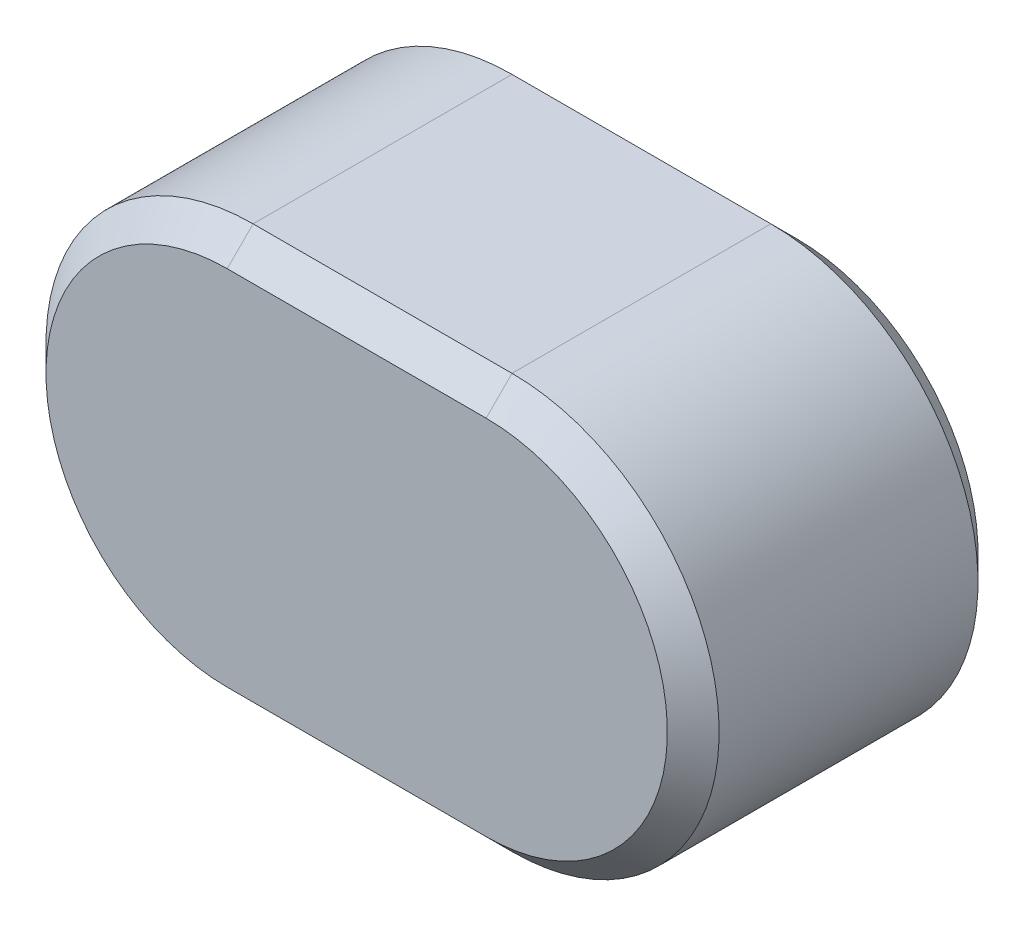
ISO-10303-21;
HEADER;
FILE_DESCRIPTION(('STEP AP214'),'2;1');
FILE_NAME('part.step','',(''),(''),'','','');
FILE_SCHEMA(('AUTOMOTIVE_DESIGN { 1 0 10303 214 1 1 1 1 }'));
ENDSEC;
DATA;
#1=APPLICATION_CONTEXT('core data for automotive mechanical design processes');
#2=APPLICATION_PROTOCOL_DEFINITION('international standard','automotive_design',2000,#1);
#3=PRODUCT_CONTEXT('',#1,'mechanical');
#4=PRODUCT('Part','Part','',(#3));
#5=PRODUCT_RELATED_PRODUCT_CATEGORY('part','',(#4));
#6=PRODUCT_DEFINITION_FORMATION('','',#4);
#7=PRODUCT_DEFINITION_CONTEXT('part definition',#1,'design');
#8=PRODUCT_DEFINITION('design','',#6,#7);
#9=PRODUCT_DEFINITION_SHAPE('','',#8);
#10=(LENGTH_UNIT() NAMED_UNIT(*) SI_UNIT(.MILLI.,.METRE.));
#11=(NAMED_UNIT(*) PLANE_ANGLE_UNIT() SI_UNIT($,.RADIAN.));
#12=(NAMED_UNIT(*) SI_UNIT($,.STERADIAN.) SOLID_ANGLE_UNIT());
#13=UNCERTAINTY_MEASURE_WITH_UNIT(LENGTH_MEASURE(1.E-05),#10,'distance_accuracy_value','');
#14=(GEOMETRIC_REPRESENTATION_CONTEXT(3) GLOBAL_UNCERTAINTY_ASSIGNED_CONTEXT((#13)) GLOBAL_UNIT_ASSIGNED_CONTEXT((#10,
#11,#12)) REPRESENTATION_CONTEXT('',''));
#15=CARTESIAN_POINT('',(0.,0.,0.));
#16=DIRECTION('',(0.,0.,1.));
#17=DIRECTION('',(1.,0.,0.));
#18=AXIS2_PLACEMENT_3D('',#15,#16,#17);
#19=CARTESIAN_POINT('',(-2.5,0.,6.));
#20=DIRECTION('',(0.,0.,-1.));
#21=DIRECTION('',(-1.,0.,0.));
#22=AXIS2_PLACEMENT_3D('',#19,#20,#21);
#23=CYLINDRICAL_SURFACE('',#22,4.);
#24=DIRECTION('',(0.,0.,-1.));
#25=VECTOR('',#24,1.);
#26=CARTESIAN_POINT('',(-2.5,4.,6.));
#27=LINE('',#26,#25);
#28=CARTESIAN_POINT('',(-2.5,4.,5.5));
#29=VERTEX_POINT('',#28);
#30=CARTESIAN_POINT('',(-2.5,4.,0.5));
#31=VERTEX_POINT('',#30);
#32=EDGE_CURVE('E173',#29,#31,#27,.T.);
#33=ORIENTED_EDGE('',*,*,#32,.T.);
#34=CARTESIAN_POINT('',(-2.5,0.,0.5));
#35=DIRECTION('',(0.,0.,1.));
#36=DIRECTION('',(1.,0.,0.));
#37=AXIS2_PLACEMENT_3D('',#34,#35,#36);
#38=CIRCLE('',#37,4.);
#39=CARTESIAN_POINT('',(-2.5,-4.,0.5));
#40=VERTEX_POINT('',#39);
#41=EDGE_CURVE('E154',#31,#40,#38,.T.);
#42=ORIENTED_EDGE('',*,*,#41,.T.);
#43=DIRECTION('',(0.,0.,-1.));
#44=VECTOR('',#43,1.);
#45=CARTESIAN_POINT('',(-2.5,-4.,6.));
#46=LINE('',#45,#44);
#47=CARTESIAN_POINT('',(-2.5,-4.,5.5));
#48=VERTEX_POINT('',#47);
#49=EDGE_CURVE('E129',#48,#40,#46,.T.);
#50=ORIENTED_EDGE('',*,*,#49,.F.);
#51=CARTESIAN_POINT('',(-2.5,0.,5.5));
#52=DIRECTION('',(0.,0.,1.));
#53=DIRECTION('',(1.,0.,0.));
#54=AXIS2_PLACEMENT_3D('',#51,#52,#53);
#55=CIRCLE('',#54,4.);
#56=EDGE_CURVE('E151',#48,#29,#55,.F.);
#57=ORIENTED_EDGE('',*,*,#56,.T.);
#58=EDGE_LOOP('',(#33,#42,#50,#57));
#59=FACE_BOUND('',#58,.T.);
#60=ADVANCED_FACE('F36',(#59),#23,.T.);
#61=CARTESIAN_POINT('',(-2.5,-4.,6.));
#62=DIRECTION('',(0.,1.,0.));
#63=DIRECTION('',(-1.,0.,0.));
#64=AXIS2_PLACEMENT_3D('',#61,#62,#63);
#65=PLANE('',#64);
#66=ORIENTED_EDGE('',*,*,#49,.T.);
#67=DIRECTION('',(1.,0.,0.));
#68=VECTOR('',#67,1.);
#69=CARTESIAN_POINT('',(-2.5,-4.,0.5));
#70=LINE('',#69,#68);
#71=CARTESIAN_POINT('',(2.5,-4.,0.5));
#72=VERTEX_POINT('',#71);
#73=EDGE_CURVE('E128',#40,#72,#70,.T.);
#74=ORIENTED_EDGE('',*,*,#73,.T.);
#75=DIRECTION('',(0.,0.,-1.));
#76=VECTOR('',#75,1.);
#77=CARTESIAN_POINT('',(2.5,-4.,6.));
#78=LINE('',#77,#76);
#79=CARTESIAN_POINT('',(2.5,-4.,5.5));
#80=VERTEX_POINT('',#79);
#81=EDGE_CURVE('E110',#80,#72,#78,.T.);
#82=ORIENTED_EDGE('',*,*,#81,.F.);
#83=DIRECTION('',(-1.,0.,0.));
#84=VECTOR('',#83,1.);
#85=CARTESIAN_POINT('',(-2.5,-4.,5.5));
#86=LINE('',#85,#84);
#87=EDGE_CURVE('E125',#80,#48,#86,.T.);
#88=ORIENTED_EDGE('',*,*,#87,.T.);
#89=EDGE_LOOP('',(#66,#74,#82,#88));
#90=FACE_BOUND('',#89,.T.);
#91=ADVANCED_FACE('F123',(#90),#65,.F.);
#92=CARTESIAN_POINT('',(2.5,0.,6.));
#93=DIRECTION('',(0.,0.,-1.));
#94=DIRECTION('',(-1.,0.,0.));
#95=AXIS2_PLACEMENT_3D('',#92,#93,#94);
#96=CYLINDRICAL_SURFACE('',#95,4.);
#97=ORIENTED_EDGE('',*,*,#81,.T.);
#98=CARTESIAN_POINT('',(2.5,0.,0.5));
#99=DIRECTION('',(0.,0.,1.));
#100=DIRECTION('',(1.,0.,0.));
#101=AXIS2_PLACEMENT_3D('',#98,#99,#100);
#102=CIRCLE('',#101,4.);
#103=CARTESIAN_POINT('',(2.5,4.,0.5));
#104=VERTEX_POINT('',#103);
#105=EDGE_CURVE('E117',#72,#104,#102,.T.);
#106=ORIENTED_EDGE('',*,*,#105,.T.);
#107=DIRECTION('',(0.,0.,-1.));
#108=VECTOR('',#107,1.);
#109=CARTESIAN_POINT('',(2.5,4.,6.));
#110=LINE('',#109,#108);
#111=CARTESIAN_POINT('',(2.5,4.,5.5));
#112=VERTEX_POINT('',#111);
#113=EDGE_CURVE('E112',#112,#104,#110,.T.);
#114=ORIENTED_EDGE('',*,*,#113,.F.);
#115=CARTESIAN_POINT('',(2.5,0.,5.5));
#116=DIRECTION('',(0.,0.,1.));
#117=DIRECTION('',(1.,0.,0.));
#118=AXIS2_PLACEMENT_3D('',#115,#116,#117);
#119=CIRCLE('',#118,4.);
#120=EDGE_CURVE('E107',#112,#80,#119,.F.);
#121=ORIENTED_EDGE('',*,*,#120,.T.);
#122=EDGE_LOOP('',(#97,#106,#114,#121));
#123=FACE_BOUND('',#122,.T.);
#124=ADVANCED_FACE('F109',(#123),#96,.T.);
#125=CARTESIAN_POINT('',(-2.5,4.,6.));
#126=DIRECTION('',(0.,-1.,0.));
#127=DIRECTION('',(1.,0.,0.));
#128=AXIS2_PLACEMENT_3D('',#125,#126,#127);
#129=PLANE('',#128);
#130=ORIENTED_EDGE('',*,*,#113,.T.);
#131=DIRECTION('',(-1.,0.,0.));
#132=VECTOR('',#131,1.);
#133=CARTESIAN_POINT('',(-2.5,4.,0.5));
#134=LINE('',#133,#132);
#135=EDGE_CURVE('E158',#104,#31,#134,.T.);
#136=ORIENTED_EDGE('',*,*,#135,.T.);
#137=ORIENTED_EDGE('',*,*,#32,.F.);
#138=DIRECTION('',(1.,0.,0.));
#139=VECTOR('',#138,1.);
#140=CARTESIAN_POINT('',(2.5,4.,5.5));
#141=LINE('',#140,#139);
#142=EDGE_CURVE('E156',#29,#112,#141,.T.);
#143=ORIENTED_EDGE('',*,*,#142,.T.);
#144=EDGE_LOOP('',(#130,#136,#137,#143));
#145=FACE_BOUND('',#144,.T.);
#146=ADVANCED_FACE('F184',(#145),#129,.F.);
#147=CARTESIAN_POINT('',(-2.5,0.,6.));
#148=DIRECTION('',(0.,0.,1.));
#149=DIRECTION('',(1.,0.,0.));
#150=AXIS2_PLACEMENT_3D('',#147,#148,#149);
#151=PLANE('',#150);
#152=DIRECTION('',(-1.,0.,0.));
#153=VECTOR('',#152,1.);
#154=CARTESIAN_POINT('',(-2.5,3.5,6.));
#155=LINE('',#154,#153);
#156=CARTESIAN_POINT('',(2.5,3.5,6.));
#157=VERTEX_POINT('',#156);
#158=CARTESIAN_POINT('',(-2.5,3.5,6.));
#159=VERTEX_POINT('',#158);
#160=EDGE_CURVE('E61',#157,#159,#155,.T.);
#161=ORIENTED_EDGE('',*,*,#160,.T.);
#162=CARTESIAN_POINT('',(-2.5,0.,6.));
#163=DIRECTION('',(0.,0.,1.));
#164=DIRECTION('',(1.,0.,0.));
#165=AXIS2_PLACEMENT_3D('',#162,#163,#164);
#166=CIRCLE('',#165,3.5);
#167=CARTESIAN_POINT('',(-2.5,-3.5,6.));
#168=VERTEX_POINT('',#167);
#169=EDGE_CURVE('E11',#159,#168,#166,.T.);
#170=ORIENTED_EDGE('',*,*,#169,.T.);
#171=DIRECTION('',(1.,0.,0.));
#172=VECTOR('',#171,1.);
#173=CARTESIAN_POINT('',(2.5,-3.5,6.));
#174=LINE('',#173,#172);
#175=CARTESIAN_POINT('',(2.5,-3.5,6.));
#176=VERTEX_POINT('',#175);
#177=EDGE_CURVE('E46',#168,#176,#174,.T.);
#178=ORIENTED_EDGE('',*,*,#177,.T.);
#179=CARTESIAN_POINT('',(2.5,0.,6.));
#180=DIRECTION('',(0.,0.,1.));
#181=DIRECTION('',(1.,0.,0.));
#182=AXIS2_PLACEMENT_3D('',#179,#180,#181);
#183=CIRCLE('',#182,3.5);
#184=EDGE_CURVE('E134',#176,#157,#183,.T.);
#185=ORIENTED_EDGE('',*,*,#184,.T.);
#186=EDGE_LOOP('',(#161,#170,#178,#185));
#187=FACE_BOUND('',#186,.T.);
#188=ADVANCED_FACE('F282',(#187),#151,.T.);
#189=CARTESIAN_POINT('',(-2.5,0.,0.));
#190=DIRECTION('',(0.,0.,1.));
#191=DIRECTION('',(1.,0.,0.));
#192=AXIS2_PLACEMENT_3D('',#189,#190,#191);
#193=PLANE('',#192);
#194=CARTESIAN_POINT('',(2.5,0.,0.));
#195=DIRECTION('',(0.,0.,1.));
#196=DIRECTION('',(1.,0.,0.));
#197=AXIS2_PLACEMENT_3D('',#194,#195,#196);
#198=CIRCLE('',#197,3.5);
#199=CARTESIAN_POINT('',(2.5,3.5,0.));
#200=VERTEX_POINT('',#199);
#201=CARTESIAN_POINT('',(2.5,-3.5,0.));
#202=VERTEX_POINT('',#201);
#203=EDGE_CURVE('E146',#200,#202,#198,.F.);
#204=ORIENTED_EDGE('',*,*,#203,.T.);
#205=DIRECTION('',(-1.,0.,0.));
#206=VECTOR('',#205,1.);
#207=CARTESIAN_POINT('',(-2.5,-3.5,0.));
#208=LINE('',#207,#206);
#209=CARTESIAN_POINT('',(-2.5,-3.5,0.));
#210=VERTEX_POINT('',#209);
#211=EDGE_CURVE('E118',#202,#210,#208,.T.);
#212=ORIENTED_EDGE('',*,*,#211,.T.);
#213=CARTESIAN_POINT('',(-2.5,0.,0.));
#214=DIRECTION('',(0.,0.,1.));
#215=DIRECTION('',(1.,0.,0.));
#216=AXIS2_PLACEMENT_3D('',#213,#214,#215);
#217=CIRCLE('',#216,3.5);
#218=CARTESIAN_POINT('',(-2.5,3.5,0.));
#219=VERTEX_POINT('',#218);
#220=EDGE_CURVE('E144',#210,#219,#217,.F.);
#221=ORIENTED_EDGE('',*,*,#220,.T.);
#222=DIRECTION('',(1.,0.,0.));
#223=VECTOR('',#222,1.);
#224=CARTESIAN_POINT('',(-2.5,3.5,0.));
#225=LINE('',#224,#223);
#226=EDGE_CURVE('E139',#219,#200,#225,.T.);
#227=ORIENTED_EDGE('',*,*,#226,.T.);
#228=EDGE_LOOP('',(#204,#212,#221,#227));
#229=FACE_BOUND('',#228,.T.);
#230=ADVANCED_FACE('F200',(#229),#193,.F.);
#231=CARTESIAN_POINT('',(-2.5,4.,0.5));
#232=DIRECTION('',(0.,-0.707106781186546,0.707106781186549));
#233=DIRECTION('',(-1.,0.,0.));
#234=AXIS2_PLACEMENT_3D('',#231,#232,#233);
#235=PLANE('',#234);
#236=DIRECTION('',(0.,0.707106781186549,0.707106781186546));
#237=VECTOR('',#236,1.);
#238=CARTESIAN_POINT('',(2.5,3.5,0.));
#239=LINE('',#238,#237);
#240=EDGE_CURVE('E167',#200,#104,#239,.T.);
#241=ORIENTED_EDGE('',*,*,#240,.F.);
#242=ORIENTED_EDGE('',*,*,#226,.F.);
#243=DIRECTION('',(0.,-0.707106781186549,-0.707106781186546));
#244=VECTOR('',#243,1.);
#245=CARTESIAN_POINT('',(-2.5,4.,0.5));
#246=LINE('',#245,#244);
#247=EDGE_CURVE('E170',#31,#219,#246,.T.);
#248=ORIENTED_EDGE('',*,*,#247,.F.);
#249=ORIENTED_EDGE('',*,*,#135,.F.);
#250=EDGE_LOOP('',(#241,#242,#248,#249));
#251=FACE_BOUND('',#250,.T.);
#252=ADVANCED_FACE('F190',(#251),#235,.F.);
#253=CARTESIAN_POINT('',(-2.5,0.,0.5));
#254=DIRECTION('',(0.,0.,1.));
#255=DIRECTION('',(1.,0.,0.));
#256=AXIS2_PLACEMENT_3D('',#253,#254,#255);
#257=CONICAL_SURFACE('',#256,4.,0.78539816339745);
#258=ORIENTED_EDGE('',*,*,#247,.T.);
#259=ORIENTED_EDGE('',*,*,#220,.F.);
#260=DIRECTION('',(0.,0.707106781186549,-0.707106781186546));
#261=VECTOR('',#260,1.);
#262=CARTESIAN_POINT('',(-2.5,-4.,0.5));
#263=LINE('',#262,#261);
#264=EDGE_CURVE('E165',#40,#210,#263,.T.);
#265=ORIENTED_EDGE('',*,*,#264,.F.);
#266=ORIENTED_EDGE('',*,*,#41,.F.);
#267=EDGE_LOOP('',(#258,#259,#265,#266));
#268=FACE_BOUND('',#267,.T.);
#269=ADVANCED_FACE('F206',(#268),#257,.T.);
#270=CARTESIAN_POINT('',(2.5,0.,0.5));
#271=DIRECTION('',(0.,0.,1.));
#272=DIRECTION('',(1.,0.,0.));
#273=AXIS2_PLACEMENT_3D('',#270,#271,#272);
#274=CONICAL_SURFACE('',#273,4.,0.78539816339745);
#275=ORIENTED_EDGE('',*,*,#240,.T.);
#276=ORIENTED_EDGE('',*,*,#105,.F.);
#277=DIRECTION('',(0.,-0.707106781186549,0.707106781186546));
#278=VECTOR('',#277,1.);
#279=CARTESIAN_POINT('',(2.5,-3.5,0.));
#280=LINE('',#279,#278);
#281=EDGE_CURVE('E163',#202,#72,#280,.T.);
#282=ORIENTED_EDGE('',*,*,#281,.F.);
#283=ORIENTED_EDGE('',*,*,#203,.F.);
#284=EDGE_LOOP('',(#275,#276,#282,#283));
#285=FACE_BOUND('',#284,.T.);
#286=ADVANCED_FACE('F196',(#285),#274,.T.);
#287=CARTESIAN_POINT('',(-2.5,-4.,0.5));
#288=DIRECTION('',(0.,0.707106781186546,0.707106781186549));
#289=DIRECTION('',(1.,0.,0.));
#290=AXIS2_PLACEMENT_3D('',#287,#288,#289);
#291=PLANE('',#290);
#292=ORIENTED_EDGE('',*,*,#264,.T.);
#293=ORIENTED_EDGE('',*,*,#211,.F.);
#294=ORIENTED_EDGE('',*,*,#281,.T.);
#295=ORIENTED_EDGE('',*,*,#73,.F.);
#296=EDGE_LOOP('',(#292,#293,#294,#295));
#297=FACE_BOUND('',#296,.T.);
#298=ADVANCED_FACE('F202',(#297),#291,.F.);
#299=CARTESIAN_POINT('',(2.5,0.,6.));
#300=DIRECTION('',(0.,0.,-1.));
#301=DIRECTION('',(-1.,0.,0.));
#302=AXIS2_PLACEMENT_3D('',#299,#300,#301);
#303=CONICAL_SURFACE('',#302,3.5,0.785398163397447);
#304=DIRECTION('',(0.,0.707106781186546,0.707106781186549));
#305=VECTOR('',#304,1.);
#306=CARTESIAN_POINT('',(2.5,-4.,5.5));
#307=LINE('',#306,#305);
#308=EDGE_CURVE('E133',#80,#176,#307,.T.);
#309=ORIENTED_EDGE('',*,*,#308,.F.);
#310=ORIENTED_EDGE('',*,*,#120,.F.);
#311=DIRECTION('',(0.,0.707106781186546,-0.707106781186549));
#312=VECTOR('',#311,1.);
#313=CARTESIAN_POINT('',(2.5,3.5,6.));
#314=LINE('',#313,#312);
#315=EDGE_CURVE('E41',#157,#112,#314,.T.);
#316=ORIENTED_EDGE('',*,*,#315,.F.);
#317=ORIENTED_EDGE('',*,*,#184,.F.);
#318=EDGE_LOOP('',(#309,#310,#316,#317));
#319=FACE_BOUND('',#318,.T.);
#320=ADVANCED_FACE('F39',(#319),#303,.T.);
#321=CARTESIAN_POINT('',(-2.5,3.5,6.));
#322=DIRECTION('',(0.,0.707106781186549,0.707106781186546));
#323=DIRECTION('',(1.,0.,0.));
#324=AXIS2_PLACEMENT_3D('',#321,#322,#323);
#325=PLANE('',#324);
#326=ORIENTED_EDGE('',*,*,#315,.T.);
#327=ORIENTED_EDGE('',*,*,#142,.F.);
#328=DIRECTION('',(0.,0.707106781186546,-0.707106781186549));
#329=VECTOR('',#328,1.);
#330=CARTESIAN_POINT('',(-2.5,3.5,6.));
#331=LINE('',#330,#329);
#332=EDGE_CURVE('E136',#159,#29,#331,.T.);
#333=ORIENTED_EDGE('',*,*,#332,.F.);
#334=ORIENTED_EDGE('',*,*,#160,.F.);
#335=EDGE_LOOP('',(#326,#327,#333,#334));
#336=FACE_BOUND('',#335,.T.);
#337=ADVANCED_FACE('F178',(#336),#325,.T.);
#338=CARTESIAN_POINT('',(-2.5,-3.5,6.));
#339=DIRECTION('',(0.,-0.707106781186549,0.707106781186546));
#340=DIRECTION('',(-1.,0.,0.));
#341=AXIS2_PLACEMENT_3D('',#338,#339,#340);
#342=PLANE('',#341);
#343=ORIENTED_EDGE('',*,*,#308,.T.);
#344=ORIENTED_EDGE('',*,*,#177,.F.);
#345=DIRECTION('',(0.,0.707106781186546,0.707106781186549));
#346=VECTOR('',#345,1.);
#347=CARTESIAN_POINT('',(-2.5,-4.,5.5));
#348=LINE('',#347,#346);
#349=EDGE_CURVE('E54',#48,#168,#348,.T.);
#350=ORIENTED_EDGE('',*,*,#349,.F.);
#351=ORIENTED_EDGE('',*,*,#87,.F.);
#352=EDGE_LOOP('',(#343,#344,#350,#351));
#353=FACE_BOUND('',#352,.T.);
#354=ADVANCED_FACE('F137',(#353),#342,.T.);
#355=CARTESIAN_POINT('',(-2.5,0.,6.));
#356=DIRECTION('',(0.,0.,-1.));
#357=DIRECTION('',(-1.,0.,0.));
#358=AXIS2_PLACEMENT_3D('',#355,#356,#357);
#359=CONICAL_SURFACE('',#358,3.5,0.785398163397447);
#360=ORIENTED_EDGE('',*,*,#332,.T.);
#361=ORIENTED_EDGE('',*,*,#56,.F.);
#362=ORIENTED_EDGE('',*,*,#349,.T.);
#363=ORIENTED_EDGE('',*,*,#169,.F.);
#364=EDGE_LOOP('',(#360,#361,#362,#363));
#365=FACE_BOUND('',#364,.T.);
#366=ADVANCED_FACE('F176',(#365),#359,.T.);
#367=CLOSED_SHELL('',(#60,#91,#124,#146,#188,#230,#252,#269,#286,#298,#320,#337,#354,#366));
#368=MANIFOLD_SOLID_BREP('B2',#367);
#369=ADVANCED_BREP_SHAPE_REPRESENTATION('',(#18,#368),#14);
#370=SHAPE_DEFINITION_REPRESENTATION(#9,#369);
ENDSEC;
END-ISO-10303-21;
